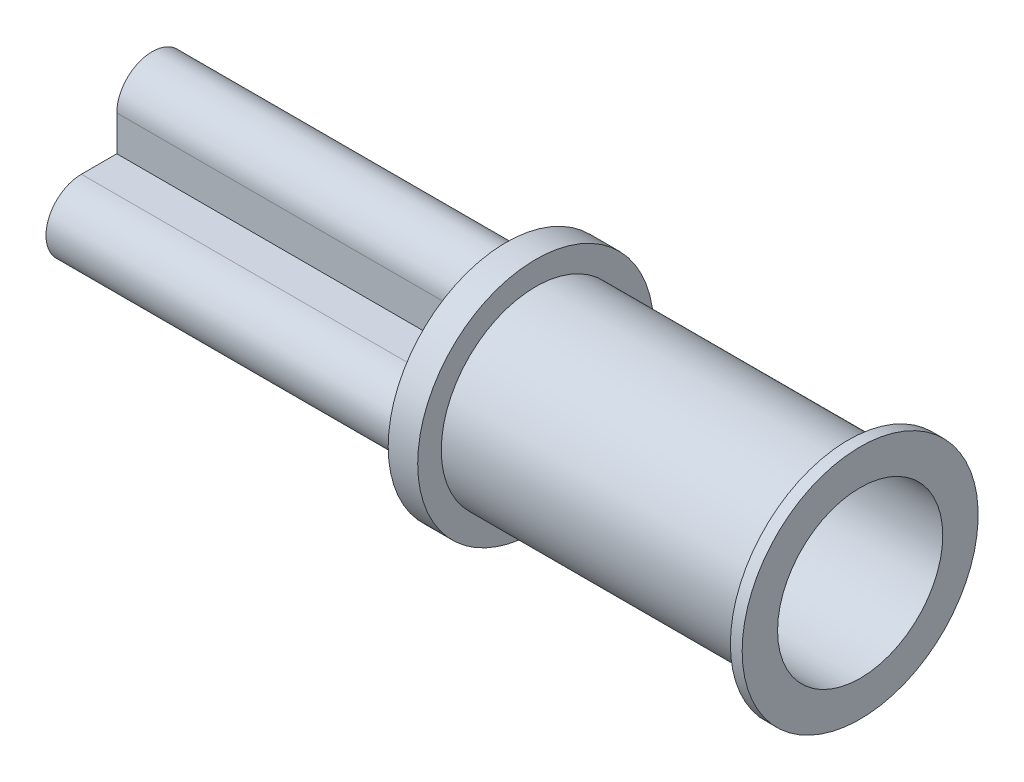
ISO-10303-21;
HEADER;
FILE_DESCRIPTION(('STEP AP214'),'2;1');
FILE_NAME('part.step','',(''),(''),'','','');
FILE_SCHEMA(('AUTOMOTIVE_DESIGN { 1 0 10303 214 1 1 1 1 }'));
ENDSEC;
DATA;
#1=APPLICATION_CONTEXT('core data for automotive mechanical design processes');
#2=APPLICATION_PROTOCOL_DEFINITION('international standard','automotive_design',2000,#1);
#3=PRODUCT_CONTEXT('',#1,'mechanical');
#4=PRODUCT('Part','Part','',(#3));
#5=PRODUCT_RELATED_PRODUCT_CATEGORY('part','',(#4));
#6=PRODUCT_DEFINITION_FORMATION('','',#4);
#7=PRODUCT_DEFINITION_CONTEXT('part definition',#1,'design');
#8=PRODUCT_DEFINITION('design','',#6,#7);
#9=PRODUCT_DEFINITION_SHAPE('','',#8);
#10=(LENGTH_UNIT() NAMED_UNIT(*) SI_UNIT(.MILLI.,.METRE.));
#11=(NAMED_UNIT(*) PLANE_ANGLE_UNIT() SI_UNIT($,.RADIAN.));
#12=(NAMED_UNIT(*) SI_UNIT($,.STERADIAN.) SOLID_ANGLE_UNIT());
#13=UNCERTAINTY_MEASURE_WITH_UNIT(LENGTH_MEASURE(1.E-05),#10,'distance_accuracy_value','');
#14=(GEOMETRIC_REPRESENTATION_CONTEXT(3) GLOBAL_UNCERTAINTY_ASSIGNED_CONTEXT((#13)) GLOBAL_UNIT_ASSIGNED_CONTEXT((#10,
#11,#12)) REPRESENTATION_CONTEXT('',''));
#15=CARTESIAN_POINT('',(0.,0.,0.));
#16=DIRECTION('',(0.,0.,1.));
#17=DIRECTION('',(1.,0.,0.));
#18=AXIS2_PLACEMENT_3D('',#15,#16,#17);
#19=CARTESIAN_POINT('',(0.635,0.,0.));
#20=DIRECTION('',(-1.,0.,0.));
#21=DIRECTION('',(0.,0.,1.));
#22=AXIS2_PLACEMENT_3D('',#19,#20,#21);
#23=PLANE('',#22);
#24=CARTESIAN_POINT('',(0.635,0.,0.));
#25=DIRECTION('',(-1.,0.,0.));
#26=DIRECTION('',(0.,0.,1.));
#27=AXIS2_PLACEMENT_3D('',#24,#25,#26);
#28=CIRCLE('',#27,1.778);
#29=CARTESIAN_POINT('',(0.635,0.,1.778));
#30=VERTEX_POINT('',#29);
#31=EDGE_CURVE('E11',#30,#30,#28,.T.);
#32=ORIENTED_EDGE('',*,*,#31,.F.);
#33=EDGE_LOOP('',(#32));
#34=FACE_BOUND('',#33,.T.);
#35=ADVANCED_FACE('F34',(#34),#23,.F.);
#36=CARTESIAN_POINT('',(0.,0.,0.));
#37=DIRECTION('',(-1.,0.,0.));
#38=DIRECTION('',(0.,0.,1.));
#39=AXIS2_PLACEMENT_3D('',#36,#37,#38);
#40=CYLINDRICAL_SURFACE('',#39,1.778);
#41=CARTESIAN_POINT('',(7.62,0.,0.));
#42=DIRECTION('',(-1.,0.,0.));
#43=DIRECTION('',(0.,0.,1.));
#44=AXIS2_PLACEMENT_3D('',#41,#42,#43);
#45=CIRCLE('',#44,1.778);
#46=CARTESIAN_POINT('',(7.62,0.,1.778));
#47=VERTEX_POINT('',#46);
#48=EDGE_CURVE('E41',#47,#47,#45,.T.);
#49=ORIENTED_EDGE('',*,*,#48,.F.);
#50=EDGE_LOOP('',(#49));
#51=FACE_BOUND('',#50,.T.);
#52=ORIENTED_EDGE('',*,*,#31,.T.);
#53=EDGE_LOOP('',(#52));
#54=FACE_BOUND('',#53,.T.);
#55=ADVANCED_FACE('F233',(#51,#54),#40,.F.);
#56=CARTESIAN_POINT('',(7.62,2.54,0.));
#57=DIRECTION('',(-1.,0.,0.));
#58=DIRECTION('',(0.,0.,1.));
#59=AXIS2_PLACEMENT_3D('',#56,#57,#58);
#60=PLANE('',#59);
#61=CARTESIAN_POINT('',(7.62,0.,0.));
#62=DIRECTION('',(-1.,0.,0.));
#63=DIRECTION('',(0.,0.,1.));
#64=AXIS2_PLACEMENT_3D('',#61,#62,#63);
#65=CIRCLE('',#64,2.54);
#66=CARTESIAN_POINT('',(7.62,0.,2.54));
#67=VERTEX_POINT('',#66);
#68=EDGE_CURVE('E226',#67,#67,#65,.T.);
#69=ORIENTED_EDGE('',*,*,#68,.F.);
#70=EDGE_LOOP('',(#69));
#71=FACE_BOUND('',#70,.T.);
#72=ORIENTED_EDGE('',*,*,#48,.T.);
#73=EDGE_LOOP('',(#72));
#74=FACE_BOUND('',#73,.T.);
#75=ADVANCED_FACE('F231',(#71,#74),#60,.F.);
#76=CARTESIAN_POINT('',(0.,0.,0.));
#77=DIRECTION('',(-1.,0.,0.));
#78=DIRECTION('',(0.,0.,1.));
#79=AXIS2_PLACEMENT_3D('',#76,#77,#78);
#80=CYLINDRICAL_SURFACE('',#79,2.54);
#81=CARTESIAN_POINT('',(7.366,0.,0.));
#82=DIRECTION('',(-1.,0.,0.));
#83=DIRECTION('',(0.,0.,1.));
#84=AXIS2_PLACEMENT_3D('',#81,#82,#83);
#85=CIRCLE('',#84,2.54);
#86=CARTESIAN_POINT('',(7.366,0.,2.54));
#87=VERTEX_POINT('',#86);
#88=EDGE_CURVE('E223',#87,#87,#85,.T.);
#89=ORIENTED_EDGE('',*,*,#88,.F.);
#90=EDGE_LOOP('',(#89));
#91=FACE_BOUND('',#90,.T.);
#92=ORIENTED_EDGE('',*,*,#68,.T.);
#93=EDGE_LOOP('',(#92));
#94=FACE_BOUND('',#93,.T.);
#95=ADVANCED_FACE('F251',(#91,#94),#80,.T.);
#96=CARTESIAN_POINT('',(7.366,2.032,0.));
#97=DIRECTION('',(1.,0.,0.));
#98=DIRECTION('',(0.,0.,-1.));
#99=AXIS2_PLACEMENT_3D('',#96,#97,#98);
#100=PLANE('',#99);
#101=CARTESIAN_POINT('',(7.366,0.,0.));
#102=DIRECTION('',(-1.,0.,0.));
#103=DIRECTION('',(0.,0.,1.));
#104=AXIS2_PLACEMENT_3D('',#101,#102,#103);
#105=CIRCLE('',#104,2.032);
#106=CARTESIAN_POINT('',(7.366,0.,2.032));
#107=VERTEX_POINT('',#106);
#108=EDGE_CURVE('E220',#107,#107,#105,.T.);
#109=ORIENTED_EDGE('',*,*,#108,.F.);
#110=EDGE_LOOP('',(#109));
#111=FACE_BOUND('',#110,.T.);
#112=ORIENTED_EDGE('',*,*,#88,.T.);
#113=EDGE_LOOP('',(#112));
#114=FACE_BOUND('',#113,.T.);
#115=ADVANCED_FACE('F259',(#111,#114),#100,.F.);
#116=CARTESIAN_POINT('',(0.,0.,0.));
#117=DIRECTION('',(-1.,0.,0.));
#118=DIRECTION('',(0.,0.,1.));
#119=AXIS2_PLACEMENT_3D('',#116,#117,#118);
#120=CYLINDRICAL_SURFACE('',#119,2.032);
#121=CARTESIAN_POINT('',(0.635,0.,0.));
#122=DIRECTION('',(-1.,0.,0.));
#123=DIRECTION('',(0.,0.,1.));
#124=AXIS2_PLACEMENT_3D('',#121,#122,#123);
#125=CIRCLE('',#124,2.032);
#126=CARTESIAN_POINT('',(0.635,0.,2.032));
#127=VERTEX_POINT('',#126);
#128=EDGE_CURVE('E217',#127,#127,#125,.T.);
#129=ORIENTED_EDGE('',*,*,#128,.F.);
#130=EDGE_LOOP('',(#129));
#131=FACE_BOUND('',#130,.T.);
#132=ORIENTED_EDGE('',*,*,#108,.T.);
#133=EDGE_LOOP('',(#132));
#134=FACE_BOUND('',#133,.T.);
#135=ADVANCED_FACE('F267',(#131,#134),#120,.T.);
#136=CARTESIAN_POINT('',(0.635,2.54,0.));
#137=DIRECTION('',(-1.,0.,0.));
#138=DIRECTION('',(0.,0.,1.));
#139=AXIS2_PLACEMENT_3D('',#136,#137,#138);
#140=PLANE('',#139);
#141=CARTESIAN_POINT('',(0.635,0.,0.));
#142=DIRECTION('',(-1.,0.,0.));
#143=DIRECTION('',(0.,0.,1.));
#144=AXIS2_PLACEMENT_3D('',#141,#142,#143);
#145=CIRCLE('',#144,2.54);
#146=CARTESIAN_POINT('',(0.635,0.,2.54));
#147=VERTEX_POINT('',#146);
#148=EDGE_CURVE('E214',#147,#147,#145,.T.);
#149=ORIENTED_EDGE('',*,*,#148,.F.);
#150=EDGE_LOOP('',(#149));
#151=FACE_BOUND('',#150,.T.);
#152=ORIENTED_EDGE('',*,*,#128,.T.);
#153=EDGE_LOOP('',(#152));
#154=FACE_BOUND('',#153,.T.);
#155=ADVANCED_FACE('F275',(#151,#154),#140,.F.);
#156=CARTESIAN_POINT('',(0.,0.,0.));
#157=DIRECTION('',(-1.,0.,0.));
#158=DIRECTION('',(0.,0.,1.));
#159=AXIS2_PLACEMENT_3D('',#156,#157,#158);
#160=CYLINDRICAL_SURFACE('',#159,2.54);
#161=CARTESIAN_POINT('',(0.,0.,0.));
#162=DIRECTION('',(-1.,0.,0.));
#163=DIRECTION('',(0.,0.,1.));
#164=AXIS2_PLACEMENT_3D('',#161,#162,#163);
#165=CIRCLE('',#164,2.54);
#166=CARTESIAN_POINT('',(0.,0.,2.54));
#167=VERTEX_POINT('',#166);
#168=EDGE_CURVE('E194',#167,#167,#165,.T.);
#169=ORIENTED_EDGE('',*,*,#168,.F.);
#170=EDGE_LOOP('',(#169));
#171=FACE_BOUND('',#170,.T.);
#172=ORIENTED_EDGE('',*,*,#148,.T.);
#173=EDGE_LOOP('',(#172));
#174=FACE_BOUND('',#173,.T.);
#175=ADVANCED_FACE('F283',(#171,#174),#160,.T.);
#176=CARTESIAN_POINT('',(0.,1.778,0.));
#177=DIRECTION('',(1.,0.,0.));
#178=DIRECTION('',(0.,0.,-1.));
#179=AXIS2_PLACEMENT_3D('',#176,#177,#178);
#180=PLANE('',#179);
#181=DIRECTION('',(0.,0.,1.));
#182=VECTOR('',#181,1.);
#183=CARTESIAN_POINT('',(0.,0.762000000000001,1.524));
#184=LINE('',#183,#182);
#185=CARTESIAN_POINT('',(0.,0.762000000000001,0.761999999999998));
#186=VERTEX_POINT('',#185);
#187=CARTESIAN_POINT('',(0.,0.762000000000001,1.524));
#188=VERTEX_POINT('',#187);
#189=EDGE_CURVE('E189',#186,#188,#184,.T.);
#190=ORIENTED_EDGE('',*,*,#189,.T.);
#191=CARTESIAN_POINT('',(0.,0.,1.524));
#192=DIRECTION('',(1.,0.,0.));
#193=DIRECTION('',(0.,0.,-1.));
#194=AXIS2_PLACEMENT_3D('',#191,#192,#193);
#195=CIRCLE('',#194,0.762);
#196=CARTESIAN_POINT('',(0.,-0.761999999999999,1.524));
#197=VERTEX_POINT('',#196);
#198=EDGE_CURVE('E161',#188,#197,#195,.T.);
#199=ORIENTED_EDGE('',*,*,#198,.T.);
#200=DIRECTION('',(0.,0.,-1.));
#201=VECTOR('',#200,1.);
#202=CARTESIAN_POINT('',(0.,-0.761999999999999,1.524));
#203=LINE('',#202,#201);
#204=CARTESIAN_POINT('',(0.,-0.761999999999998,0.761999999999998));
#205=VERTEX_POINT('',#204);
#206=EDGE_CURVE('E164',#197,#205,#203,.T.);
#207=ORIENTED_EDGE('',*,*,#206,.T.);
#208=DIRECTION('',(0.,-1.,0.));
#209=VECTOR('',#208,1.);
#210=CARTESIAN_POINT('',(0.,-0.761999999999998,0.761999999999998));
#211=LINE('',#210,#209);
#212=CARTESIAN_POINT('',(0.,-1.524,0.761999999999998));
#213=VERTEX_POINT('',#212);
#214=EDGE_CURVE('E48',#205,#213,#211,.T.);
#215=ORIENTED_EDGE('',*,*,#214,.T.);
#216=CARTESIAN_POINT('',(0.,-1.524,0.));
#217=DIRECTION('',(1.,0.,0.));
#218=DIRECTION('',(0.,0.,-1.));
#219=AXIS2_PLACEMENT_3D('',#216,#217,#218);
#220=CIRCLE('',#219,0.761999999999999);
#221=CARTESIAN_POINT('',(0.,-1.524,-0.761999999999999));
#222=VERTEX_POINT('',#221);
#223=EDGE_CURVE('E168',#213,#222,#220,.T.);
#224=ORIENTED_EDGE('',*,*,#223,.T.);
#225=DIRECTION('',(0.,1.,0.));
#226=VECTOR('',#225,1.);
#227=CARTESIAN_POINT('',(0.,-0.761999999999999,-0.761999999999999));
#228=LINE('',#227,#226);
#229=CARTESIAN_POINT('',(0.,-0.761999999999999,-0.761999999999999));
#230=VERTEX_POINT('',#229);
#231=EDGE_CURVE('E171',#222,#230,#228,.T.);
#232=ORIENTED_EDGE('',*,*,#231,.T.);
#233=DIRECTION('',(0.,0.,-1.));
#234=VECTOR('',#233,1.);
#235=CARTESIAN_POINT('',(0.,-0.761999999999999,-0.761999999999999));
#236=LINE('',#235,#234);
#237=CARTESIAN_POINT('',(0.,-0.762,-1.524));
#238=VERTEX_POINT('',#237);
#239=EDGE_CURVE('E174',#230,#238,#236,.T.);
#240=ORIENTED_EDGE('',*,*,#239,.T.);
#241=CARTESIAN_POINT('',(0.,0.,-1.524));
#242=DIRECTION('',(1.,0.,0.));
#243=DIRECTION('',(0.,0.,-1.));
#244=AXIS2_PLACEMENT_3D('',#241,#242,#243);
#245=CIRCLE('',#244,0.762);
#246=CARTESIAN_POINT('',(0.,0.762000000000001,-1.524));
#247=VERTEX_POINT('',#246);
#248=EDGE_CURVE('E177',#238,#247,#245,.T.);
#249=ORIENTED_EDGE('',*,*,#248,.T.);
#250=DIRECTION('',(0.,0.,1.));
#251=VECTOR('',#250,1.);
#252=CARTESIAN_POINT('',(0.,0.762000000000001,-0.761999999999999));
#253=LINE('',#252,#251);
#254=CARTESIAN_POINT('',(0.,0.762000000000001,-0.761999999999999));
#255=VERTEX_POINT('',#254);
#256=EDGE_CURVE('E180',#247,#255,#253,.T.);
#257=ORIENTED_EDGE('',*,*,#256,.T.);
#258=DIRECTION('',(0.,1.,0.));
#259=VECTOR('',#258,1.);
#260=CARTESIAN_POINT('',(0.,1.524,-0.761999999999999));
#261=LINE('',#260,#259);
#262=CARTESIAN_POINT('',(0.,1.524,-0.762));
#263=VERTEX_POINT('',#262);
#264=EDGE_CURVE('E183',#255,#263,#261,.T.);
#265=ORIENTED_EDGE('',*,*,#264,.T.);
#266=CARTESIAN_POINT('',(0.,1.524,0.));
#267=DIRECTION('',(1.,0.,0.));
#268=DIRECTION('',(0.,0.,-1.));
#269=AXIS2_PLACEMENT_3D('',#266,#267,#268);
#270=CIRCLE('',#269,0.761999999999999);
#271=CARTESIAN_POINT('',(0.,1.524,0.761999999999998));
#272=VERTEX_POINT('',#271);
#273=EDGE_CURVE('E186',#263,#272,#270,.T.);
#274=ORIENTED_EDGE('',*,*,#273,.T.);
#275=DIRECTION('',(0.,-1.,0.));
#276=VECTOR('',#275,1.);
#277=CARTESIAN_POINT('',(0.,1.524,0.761999999999998));
#278=LINE('',#277,#276);
#279=EDGE_CURVE('E137',#272,#186,#278,.T.);
#280=ORIENTED_EDGE('',*,*,#279,.T.);
#281=EDGE_LOOP('',(#190,#199,#207,#215,#224,#232,#240,#249,#257,#265,#274,#280));
#282=FACE_BOUND('',#281,.T.);
#283=ORIENTED_EDGE('',*,*,#168,.T.);
#284=EDGE_LOOP('',(#283));
#285=FACE_BOUND('',#284,.T.);
#286=ADVANCED_FACE('F291',(#282,#285),#180,.F.);
#287=CARTESIAN_POINT('',(-7.62,0.,1.524));
#288=DIRECTION('',(1.,0.,0.));
#289=DIRECTION('',(0.,0.,-1.));
#290=AXIS2_PLACEMENT_3D('',#287,#288,#289);
#291=CYLINDRICAL_SURFACE('',#290,0.762);
#292=ORIENTED_EDGE('',*,*,#198,.F.);
#293=DIRECTION('',(1.,0.,0.));
#294=VECTOR('',#293,1.);
#295=CARTESIAN_POINT('',(-7.62,0.762000000000001,1.524));
#296=LINE('',#295,#294);
#297=CARTESIAN_POINT('',(-7.62,0.762000000000001,1.524));
#298=VERTEX_POINT('',#297);
#299=EDGE_CURVE('E57',#298,#188,#296,.T.);
#300=ORIENTED_EDGE('',*,*,#299,.F.);
#301=CARTESIAN_POINT('',(-7.62,0.,1.524));
#302=DIRECTION('',(1.,0.,0.));
#303=DIRECTION('',(0.,0.,-1.));
#304=AXIS2_PLACEMENT_3D('',#301,#302,#303);
#305=CIRCLE('',#304,0.762);
#306=CARTESIAN_POINT('',(-7.62,-0.761999999999999,1.524));
#307=VERTEX_POINT('',#306);
#308=EDGE_CURVE('E192',#298,#307,#305,.T.);
#309=ORIENTED_EDGE('',*,*,#308,.T.);
#310=DIRECTION('',(1.,0.,0.));
#311=VECTOR('',#310,1.);
#312=CARTESIAN_POINT('',(-7.62,-0.761999999999999,1.524));
#313=LINE('',#312,#311);
#314=EDGE_CURVE('E103',#307,#197,#313,.T.);
#315=ORIENTED_EDGE('',*,*,#314,.T.);
#316=EDGE_LOOP('',(#292,#300,#309,#315));
#317=FACE_BOUND('',#316,.T.);
#318=ADVANCED_FACE('F299',(#317),#291,.T.);
#319=CARTESIAN_POINT('',(-7.62,0.762000000000001,1.524));
#320=DIRECTION('',(0.,1.,0.));
#321=DIRECTION('',(0.,0.,1.));
#322=AXIS2_PLACEMENT_3D('',#319,#320,#321);
#323=PLANE('',#322);
#324=ORIENTED_EDGE('',*,*,#189,.F.);
#325=DIRECTION('',(1.,0.,0.));
#326=VECTOR('',#325,1.);
#327=CARTESIAN_POINT('',(-7.62,0.762000000000001,0.761999999999998));
#328=LINE('',#327,#326);
#329=CARTESIAN_POINT('',(-7.62,0.762000000000001,0.761999999999998));
#330=VERTEX_POINT('',#329);
#331=EDGE_CURVE('E142',#330,#186,#328,.T.);
#332=ORIENTED_EDGE('',*,*,#331,.F.);
#333=DIRECTION('',(0.,0.,1.));
#334=VECTOR('',#333,1.);
#335=CARTESIAN_POINT('',(-7.62,0.762000000000001,1.524));
#336=LINE('',#335,#334);
#337=EDGE_CURVE('E151',#330,#298,#336,.T.);
#338=ORIENTED_EDGE('',*,*,#337,.T.);
#339=ORIENTED_EDGE('',*,*,#299,.T.);
#340=EDGE_LOOP('',(#324,#332,#338,#339));
#341=FACE_BOUND('',#340,.T.);
#342=ADVANCED_FACE('F307',(#341),#323,.T.);
#343=CARTESIAN_POINT('',(-7.62,1.524,0.761999999999998));
#344=DIRECTION('',(0.,0.,1.));
#345=DIRECTION('',(0.,-1.,0.));
#346=AXIS2_PLACEMENT_3D('',#343,#344,#345);
#347=PLANE('',#346);
#348=ORIENTED_EDGE('',*,*,#279,.F.);
#349=DIRECTION('',(1.,0.,0.));
#350=VECTOR('',#349,1.);
#351=CARTESIAN_POINT('',(-7.62,1.524,0.761999999999998));
#352=LINE('',#351,#350);
#353=CARTESIAN_POINT('',(-7.62,1.524,0.761999999999998));
#354=VERTEX_POINT('',#353);
#355=EDGE_CURVE('E131',#354,#272,#352,.T.);
#356=ORIENTED_EDGE('',*,*,#355,.F.);
#357=DIRECTION('',(0.,-1.,0.));
#358=VECTOR('',#357,1.);
#359=CARTESIAN_POINT('',(-7.62,1.524,0.761999999999998));
#360=LINE('',#359,#358);
#361=EDGE_CURVE('E134',#354,#330,#360,.T.);
#362=ORIENTED_EDGE('',*,*,#361,.T.);
#363=ORIENTED_EDGE('',*,*,#331,.T.);
#364=EDGE_LOOP('',(#348,#356,#362,#363));
#365=FACE_BOUND('',#364,.T.);
#366=ADVANCED_FACE('F133',(#365),#347,.T.);
#367=CARTESIAN_POINT('',(-7.62,1.524,0.));
#368=DIRECTION('',(1.,0.,0.));
#369=DIRECTION('',(0.,0.,-1.));
#370=AXIS2_PLACEMENT_3D('',#367,#368,#369);
#371=CYLINDRICAL_SURFACE('',#370,0.761999999999999);
#372=ORIENTED_EDGE('',*,*,#273,.F.);
#373=DIRECTION('',(1.,0.,0.));
#374=VECTOR('',#373,1.);
#375=CARTESIAN_POINT('',(-7.62,1.524,-0.762));
#376=LINE('',#375,#374);
#377=CARTESIAN_POINT('',(-7.62,1.524,-0.762));
#378=VERTEX_POINT('',#377);
#379=EDGE_CURVE('E143',#378,#263,#376,.T.);
#380=ORIENTED_EDGE('',*,*,#379,.F.);
#381=CARTESIAN_POINT('',(-7.62,1.524,0.));
#382=DIRECTION('',(1.,0.,0.));
#383=DIRECTION('',(0.,0.,-1.));
#384=AXIS2_PLACEMENT_3D('',#381,#382,#383);
#385=CIRCLE('',#384,0.761999999999999);
#386=EDGE_CURVE('E149',#378,#354,#385,.T.);
#387=ORIENTED_EDGE('',*,*,#386,.T.);
#388=ORIENTED_EDGE('',*,*,#355,.T.);
#389=EDGE_LOOP('',(#372,#380,#387,#388));
#390=FACE_BOUND('',#389,.T.);
#391=ADVANCED_FACE('F153',(#390),#371,.T.);
#392=CARTESIAN_POINT('',(-7.62,1.524,-0.761999999999999));
#393=DIRECTION('',(0.,0.,-1.));
#394=DIRECTION('',(0.,1.,0.));
#395=AXIS2_PLACEMENT_3D('',#392,#393,#394);
#396=PLANE('',#395);
#397=ORIENTED_EDGE('',*,*,#264,.F.);
#398=DIRECTION('',(1.,0.,0.));
#399=VECTOR('',#398,1.);
#400=CARTESIAN_POINT('',(-7.62,0.762000000000001,-0.761999999999999));
#401=LINE('',#400,#399);
#402=CARTESIAN_POINT('',(-7.62,0.762000000000001,-0.761999999999999));
#403=VERTEX_POINT('',#402);
#404=EDGE_CURVE('E197',#403,#255,#401,.T.);
#405=ORIENTED_EDGE('',*,*,#404,.F.);
#406=DIRECTION('',(0.,1.,0.));
#407=VECTOR('',#406,1.);
#408=CARTESIAN_POINT('',(-7.62,1.524,-0.761999999999999));
#409=LINE('',#408,#407);
#410=EDGE_CURVE('E154',#403,#378,#409,.T.);
#411=ORIENTED_EDGE('',*,*,#410,.T.);
#412=ORIENTED_EDGE('',*,*,#379,.T.);
#413=EDGE_LOOP('',(#397,#405,#411,#412));
#414=FACE_BOUND('',#413,.T.);
#415=ADVANCED_FACE('F326',(#414),#396,.T.);
#416=CARTESIAN_POINT('',(-7.62,0.762000000000001,-0.761999999999999));
#417=DIRECTION('',(0.,1.,0.));
#418=DIRECTION('',(0.,0.,1.));
#419=AXIS2_PLACEMENT_3D('',#416,#417,#418);
#420=PLANE('',#419);
#421=ORIENTED_EDGE('',*,*,#256,.F.);
#422=DIRECTION('',(1.,0.,0.));
#423=VECTOR('',#422,1.);
#424=CARTESIAN_POINT('',(-7.62,0.762000000000001,-1.524));
#425=LINE('',#424,#423);
#426=CARTESIAN_POINT('',(-7.62,0.762000000000001,-1.524));
#427=VERTEX_POINT('',#426);
#428=EDGE_CURVE('E199',#427,#247,#425,.T.);
#429=ORIENTED_EDGE('',*,*,#428,.F.);
#430=DIRECTION('',(0.,0.,1.));
#431=VECTOR('',#430,1.);
#432=CARTESIAN_POINT('',(-7.62,0.762000000000001,-0.761999999999999));
#433=LINE('',#432,#431);
#434=EDGE_CURVE('E156',#427,#403,#433,.T.);
#435=ORIENTED_EDGE('',*,*,#434,.T.);
#436=ORIENTED_EDGE('',*,*,#404,.T.);
#437=EDGE_LOOP('',(#421,#429,#435,#436));
#438=FACE_BOUND('',#437,.T.);
#439=ADVANCED_FACE('F333',(#438),#420,.T.);
#440=CARTESIAN_POINT('',(-7.62,0.,-1.524));
#441=DIRECTION('',(1.,0.,0.));
#442=DIRECTION('',(0.,0.,-1.));
#443=AXIS2_PLACEMENT_3D('',#440,#441,#442);
#444=CYLINDRICAL_SURFACE('',#443,0.762);
#445=ORIENTED_EDGE('',*,*,#248,.F.);
#446=DIRECTION('',(1.,0.,0.));
#447=VECTOR('',#446,1.);
#448=CARTESIAN_POINT('',(-7.62,-0.762,-1.524));
#449=LINE('',#448,#447);
#450=CARTESIAN_POINT('',(-7.62,-0.762,-1.524));
#451=VERTEX_POINT('',#450);
#452=EDGE_CURVE('E201',#451,#238,#449,.T.);
#453=ORIENTED_EDGE('',*,*,#452,.F.);
#454=CARTESIAN_POINT('',(-7.62,0.,-1.524));
#455=DIRECTION('',(1.,0.,0.));
#456=DIRECTION('',(0.,0.,-1.));
#457=AXIS2_PLACEMENT_3D('',#454,#455,#456);
#458=CIRCLE('',#457,0.762);
#459=EDGE_CURVE('E460',#451,#427,#458,.T.);
#460=ORIENTED_EDGE('',*,*,#459,.T.);
#461=ORIENTED_EDGE('',*,*,#428,.T.);
#462=EDGE_LOOP('',(#445,#453,#460,#461));
#463=FACE_BOUND('',#462,.T.);
#464=ADVANCED_FACE('F341',(#463),#444,.T.);
#465=CARTESIAN_POINT('',(-7.62,-0.761999999999999,-0.761999999999999));
#466=DIRECTION('',(0.,-1.,0.));
#467=DIRECTION('',(0.,0.,-1.));
#468=AXIS2_PLACEMENT_3D('',#465,#466,#467);
#469=PLANE('',#468);
#470=ORIENTED_EDGE('',*,*,#239,.F.);
#471=DIRECTION('',(1.,0.,0.));
#472=VECTOR('',#471,1.);
#473=CARTESIAN_POINT('',(-7.62,-0.761999999999999,-0.761999999999999));
#474=LINE('',#473,#472);
#475=CARTESIAN_POINT('',(-7.62,-0.761999999999999,-0.761999999999999));
#476=VERTEX_POINT('',#475);
#477=EDGE_CURVE('E203',#476,#230,#474,.T.);
#478=ORIENTED_EDGE('',*,*,#477,.F.);
#479=DIRECTION('',(0.,0.,-1.));
#480=VECTOR('',#479,1.);
#481=CARTESIAN_POINT('',(-7.62,-0.761999999999999,-0.761999999999999));
#482=LINE('',#481,#480);
#483=EDGE_CURVE('E457',#476,#451,#482,.T.);
#484=ORIENTED_EDGE('',*,*,#483,.T.);
#485=ORIENTED_EDGE('',*,*,#452,.T.);
#486=EDGE_LOOP('',(#470,#478,#484,#485));
#487=FACE_BOUND('',#486,.T.);
#488=ADVANCED_FACE('F349',(#487),#469,.T.);
#489=CARTESIAN_POINT('',(-7.62,-0.761999999999999,-0.761999999999999));
#490=DIRECTION('',(0.,0.,-1.));
#491=DIRECTION('',(-1.,0.,0.));
#492=AXIS2_PLACEMENT_3D('',#489,#490,#491);
#493=PLANE('',#492);
#494=ORIENTED_EDGE('',*,*,#231,.F.);
#495=DIRECTION('',(1.,0.,0.));
#496=VECTOR('',#495,1.);
#497=CARTESIAN_POINT('',(-7.62,-1.524,-0.761999999999999));
#498=LINE('',#497,#496);
#499=CARTESIAN_POINT('',(-7.62,-1.524,-0.761999999999999));
#500=VERTEX_POINT('',#499);
#501=EDGE_CURVE('E205',#500,#222,#498,.T.);
#502=ORIENTED_EDGE('',*,*,#501,.F.);
#503=DIRECTION('',(0.,1.,0.));
#504=VECTOR('',#503,1.);
#505=CARTESIAN_POINT('',(-7.62,-0.761999999999999,-0.761999999999999));
#506=LINE('',#505,#504);
#507=EDGE_CURVE('E454',#500,#476,#506,.T.);
#508=ORIENTED_EDGE('',*,*,#507,.T.);
#509=ORIENTED_EDGE('',*,*,#477,.T.);
#510=EDGE_LOOP('',(#494,#502,#508,#509));
#511=FACE_BOUND('',#510,.T.);
#512=ADVANCED_FACE('F357',(#511),#493,.T.);
#513=CARTESIAN_POINT('',(-7.62,-1.524,0.));
#514=DIRECTION('',(1.,0.,0.));
#515=DIRECTION('',(0.,0.,-1.));
#516=AXIS2_PLACEMENT_3D('',#513,#514,#515);
#517=CYLINDRICAL_SURFACE('',#516,0.761999999999999);
#518=ORIENTED_EDGE('',*,*,#223,.F.);
#519=DIRECTION('',(1.,0.,0.));
#520=VECTOR('',#519,1.);
#521=CARTESIAN_POINT('',(-7.62,-1.524,0.761999999999998));
#522=LINE('',#521,#520);
#523=CARTESIAN_POINT('',(-7.62,-1.524,0.761999999999998));
#524=VERTEX_POINT('',#523);
#525=EDGE_CURVE('E207',#524,#213,#522,.T.);
#526=ORIENTED_EDGE('',*,*,#525,.F.);
#527=CARTESIAN_POINT('',(-7.62,-1.524,0.));
#528=DIRECTION('',(1.,0.,0.));
#529=DIRECTION('',(0.,0.,-1.));
#530=AXIS2_PLACEMENT_3D('',#527,#528,#529);
#531=CIRCLE('',#530,0.761999999999999);
#532=EDGE_CURVE('E451',#524,#500,#531,.T.);
#533=ORIENTED_EDGE('',*,*,#532,.T.);
#534=ORIENTED_EDGE('',*,*,#501,.T.);
#535=EDGE_LOOP('',(#518,#526,#533,#534));
#536=FACE_BOUND('',#535,.T.);
#537=ADVANCED_FACE('F365',(#536),#517,.T.);
#538=CARTESIAN_POINT('',(-7.62,-0.761999999999998,0.761999999999998));
#539=DIRECTION('',(0.,0.,1.));
#540=DIRECTION('',(0.,-1.,0.));
#541=AXIS2_PLACEMENT_3D('',#538,#539,#540);
#542=PLANE('',#541);
#543=ORIENTED_EDGE('',*,*,#214,.F.);
#544=DIRECTION('',(1.,0.,0.));
#545=VECTOR('',#544,1.);
#546=CARTESIAN_POINT('',(-7.62,-0.761999999999998,0.761999999999998));
#547=LINE('',#546,#545);
#548=CARTESIAN_POINT('',(-7.62,-0.761999999999998,0.761999999999998));
#549=VERTEX_POINT('',#548);
#550=EDGE_CURVE('E209',#549,#205,#547,.T.);
#551=ORIENTED_EDGE('',*,*,#550,.F.);
#552=DIRECTION('',(0.,-1.,0.));
#553=VECTOR('',#552,1.);
#554=CARTESIAN_POINT('',(-7.62,-0.761999999999998,0.761999999999998));
#555=LINE('',#554,#553);
#556=EDGE_CURVE('E446',#549,#524,#555,.T.);
#557=ORIENTED_EDGE('',*,*,#556,.T.);
#558=ORIENTED_EDGE('',*,*,#525,.T.);
#559=EDGE_LOOP('',(#543,#551,#557,#558));
#560=FACE_BOUND('',#559,.T.);
#561=ADVANCED_FACE('F373',(#560),#542,.T.);
#562=CARTESIAN_POINT('',(-7.62,-0.761999999999999,1.524));
#563=DIRECTION('',(0.,-1.,0.));
#564=DIRECTION('',(0.,0.,-1.));
#565=AXIS2_PLACEMENT_3D('',#562,#563,#564);
#566=PLANE('',#565);
#567=ORIENTED_EDGE('',*,*,#206,.F.);
#568=ORIENTED_EDGE('',*,*,#314,.F.);
#569=DIRECTION('',(0.,0.,-1.));
#570=VECTOR('',#569,1.);
#571=CARTESIAN_POINT('',(-7.62,-0.761999999999999,1.524));
#572=LINE('',#571,#570);
#573=EDGE_CURVE('E444',#307,#549,#572,.T.);
#574=ORIENTED_EDGE('',*,*,#573,.T.);
#575=ORIENTED_EDGE('',*,*,#550,.T.);
#576=EDGE_LOOP('',(#567,#568,#574,#575));
#577=FACE_BOUND('',#576,.T.);
#578=ADVANCED_FACE('F381',(#577),#566,.T.);
#579=CARTESIAN_POINT('',(-7.62,0.,1.524));
#580=DIRECTION('',(1.,0.,0.));
#581=DIRECTION('',(0.,0.,-1.));
#582=AXIS2_PLACEMENT_3D('',#579,#580,#581);
#583=PLANE('',#582);
#584=ORIENTED_EDGE('',*,*,#308,.F.);
#585=ORIENTED_EDGE('',*,*,#337,.F.);
#586=ORIENTED_EDGE('',*,*,#361,.F.);
#587=ORIENTED_EDGE('',*,*,#386,.F.);
#588=ORIENTED_EDGE('',*,*,#410,.F.);
#589=ORIENTED_EDGE('',*,*,#434,.F.);
#590=ORIENTED_EDGE('',*,*,#459,.F.);
#591=ORIENTED_EDGE('',*,*,#483,.F.);
#592=ORIENTED_EDGE('',*,*,#507,.F.);
#593=ORIENTED_EDGE('',*,*,#532,.F.);
#594=ORIENTED_EDGE('',*,*,#556,.F.);
#595=ORIENTED_EDGE('',*,*,#573,.F.);
#596=EDGE_LOOP('',(#584,#585,#586,#587,#588,#589,#590,#591,#592,#593,#594,#595));
#597=FACE_BOUND('',#596,.T.);
#598=ADVANCED_FACE('F147',(#597),#583,.F.);
#599=CLOSED_SHELL('',(#35,#55,#75,#95,#115,#135,#155,#175,#286,#318,#342,#366,#391,#415,#439,
#464,#488,#512,#537,#561,#578,#598));
#600=MANIFOLD_SOLID_BREP('B2',#599);
#601=ADVANCED_BREP_SHAPE_REPRESENTATION('',(#18,#600),#14);
#602=SHAPE_DEFINITION_REPRESENTATION(#9,#601);
ENDSEC;
END-ISO-10303-21;
